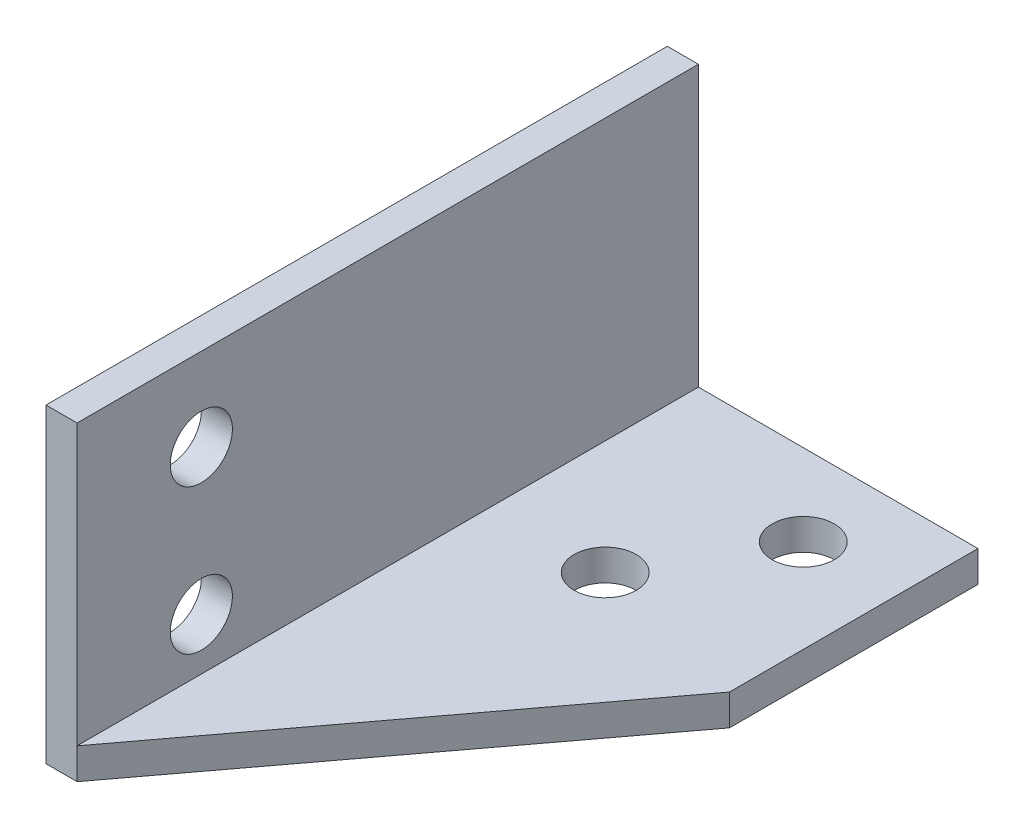
ISO-10303-21;
HEADER;
FILE_DESCRIPTION(('STEP AP214'),'2;1');
FILE_NAME('part.step','',(''),(''),'','','');
FILE_SCHEMA(('AUTOMOTIVE_DESIGN { 1 0 10303 214 1 1 1 1 }'));
ENDSEC;
DATA;
#1=APPLICATION_CONTEXT('core data for automotive mechanical design processes');
#2=APPLICATION_PROTOCOL_DEFINITION('international standard','automotive_design',2000,#1);
#3=PRODUCT_CONTEXT('',#1,'mechanical');
#4=PRODUCT('Part','Part','',(#3));
#5=PRODUCT_RELATED_PRODUCT_CATEGORY('part','',(#4));
#6=PRODUCT_DEFINITION_FORMATION('','',#4);
#7=PRODUCT_DEFINITION_CONTEXT('part definition',#1,'design');
#8=PRODUCT_DEFINITION('design','',#6,#7);
#9=PRODUCT_DEFINITION_SHAPE('','',#8);
#10=(LENGTH_UNIT() NAMED_UNIT(*) SI_UNIT(.MILLI.,.METRE.));
#11=(NAMED_UNIT(*) PLANE_ANGLE_UNIT() SI_UNIT($,.RADIAN.));
#12=(NAMED_UNIT(*) SI_UNIT($,.STERADIAN.) SOLID_ANGLE_UNIT());
#13=UNCERTAINTY_MEASURE_WITH_UNIT(LENGTH_MEASURE(1.E-05),#10,'distance_accuracy_value','');
#14=(GEOMETRIC_REPRESENTATION_CONTEXT(3) GLOBAL_UNCERTAINTY_ASSIGNED_CONTEXT((#13)) GLOBAL_UNIT_ASSIGNED_CONTEXT((#10,
#11,#12)) REPRESENTATION_CONTEXT('',''));
#15=CARTESIAN_POINT('',(0.,0.,0.));
#16=DIRECTION('',(0.,0.,1.));
#17=DIRECTION('',(1.,0.,0.));
#18=AXIS2_PLACEMENT_3D('',#15,#16,#17);
#19=CARTESIAN_POINT('',(-9.77300216930946,-21.59,30.));
#20=DIRECTION('',(1.,0.,0.));
#21=DIRECTION('',(0.,0.,-1.));
#22=AXIS2_PLACEMENT_3D('',#19,#20,#21);
#23=PLANE('',#22);
#24=CARTESIAN_POINT('',(-9.77300216930946,-17.59,24.));
#25=DIRECTION('',(1.,0.,0.));
#26=DIRECTION('',(0.,0.,-1.));
#27=AXIS2_PLACEMENT_3D('',#24,#25,#26);
#28=CIRCLE('',#27,1.5);
#29=CARTESIAN_POINT('',(-9.77300216930946,-17.59,22.5));
#30=VERTEX_POINT('',#29);
#31=EDGE_CURVE('E158',#30,#30,#28,.T.);
#32=ORIENTED_EDGE('',*,*,#31,.T.);
#33=EDGE_LOOP('',(#32));
#34=FACE_BOUND('',#33,.T.);
#35=CARTESIAN_POINT('',(-9.77300216930946,-10.59,24.));
#36=DIRECTION('',(1.,0.,0.));
#37=DIRECTION('',(0.,0.,-1.));
#38=AXIS2_PLACEMENT_3D('',#35,#36,#37);
#39=CIRCLE('',#38,1.5);
#40=CARTESIAN_POINT('',(-9.77300216930946,-10.59,22.5));
#41=VERTEX_POINT('',#40);
#42=EDGE_CURVE('E134',#41,#41,#39,.T.);
#43=ORIENTED_EDGE('',*,*,#42,.T.);
#44=EDGE_LOOP('',(#43));
#45=FACE_BOUND('',#44,.T.);
#46=DIRECTION('',(0.,-1.,0.));
#47=VECTOR('',#46,1.);
#48=CARTESIAN_POINT('',(-9.77300216930946,-21.59,0.));
#49=LINE('',#48,#47);
#50=CARTESIAN_POINT('',(-9.77300216930946,-6.59,0.));
#51=VERTEX_POINT('',#50);
#52=CARTESIAN_POINT('',(-9.77300216930946,-21.59,0.));
#53=VERTEX_POINT('',#52);
#54=EDGE_CURVE('E131',#51,#53,#49,.T.);
#55=ORIENTED_EDGE('',*,*,#54,.T.);
#56=DIRECTION('',(0.,0.,-1.));
#57=VECTOR('',#56,1.);
#58=CARTESIAN_POINT('',(-9.77300216930946,-21.59,30.));
#59=LINE('',#58,#57);
#60=CARTESIAN_POINT('',(-9.77300216930946,-21.59,30.));
#61=VERTEX_POINT('',#60);
#62=EDGE_CURVE('E38',#61,#53,#59,.T.);
#63=ORIENTED_EDGE('',*,*,#62,.F.);
#64=DIRECTION('',(0.,-1.,0.));
#65=VECTOR('',#64,1.);
#66=CARTESIAN_POINT('',(-9.77300216930946,-21.59,30.));
#67=LINE('',#66,#65);
#68=CARTESIAN_POINT('',(-9.77300216930946,-6.59,30.));
#69=VERTEX_POINT('',#68);
#70=EDGE_CURVE('E148',#69,#61,#67,.T.);
#71=ORIENTED_EDGE('',*,*,#70,.F.);
#72=DIRECTION('',(0.,0.,-1.));
#73=VECTOR('',#72,1.);
#74=CARTESIAN_POINT('',(-9.77300216930946,-6.59,30.));
#75=LINE('',#74,#73);
#76=EDGE_CURVE('E132',#69,#51,#75,.T.);
#77=ORIENTED_EDGE('',*,*,#76,.T.);
#78=EDGE_LOOP('',(#55,#63,#71,#77));
#79=FACE_BOUND('',#78,.T.);
#80=ADVANCED_FACE('F30',(#34,#45,#79),#23,.F.);
#81=CARTESIAN_POINT('',(5.22699783069054,-21.59,30.));
#82=DIRECTION('',(0.,1.,0.));
#83=DIRECTION('',(0.,0.,1.));
#84=AXIS2_PLACEMENT_3D('',#81,#82,#83);
#85=PLANE('',#84);
#86=CARTESIAN_POINT('',(0.726997830690543,-21.59,3.93782217350893));
#87=DIRECTION('',(0.,1.,0.));
#88=DIRECTION('',(0.,0.,1.));
#89=AXIS2_PLACEMENT_3D('',#86,#87,#88);
#90=CIRCLE('',#89,1.5);
#91=CARTESIAN_POINT('',(0.726997830690543,-21.59,5.43782217350893));
#92=VERTEX_POINT('',#91);
#93=EDGE_CURVE('E170',#92,#92,#90,.T.);
#94=ORIENTED_EDGE('',*,*,#93,.T.);
#95=EDGE_LOOP('',(#94));
#96=FACE_BOUND('',#95,.T.);
#97=CARTESIAN_POINT('',(-2.77300216930946,-21.59,10.));
#98=DIRECTION('',(0.,1.,0.));
#99=DIRECTION('',(0.,0.,1.));
#100=AXIS2_PLACEMENT_3D('',#97,#98,#99);
#101=CIRCLE('',#100,1.5);
#102=CARTESIAN_POINT('',(-2.77300216930946,-21.59,11.5));
#103=VERTEX_POINT('',#102);
#104=EDGE_CURVE('E164',#103,#103,#101,.T.);
#105=ORIENTED_EDGE('',*,*,#104,.T.);
#106=EDGE_LOOP('',(#105));
#107=FACE_BOUND('',#106,.T.);
#108=DIRECTION('',(0.,0.,-1.));
#109=VECTOR('',#108,1.);
#110=CARTESIAN_POINT('',(5.22699783069054,-21.59,30.));
#111=LINE('',#110,#109);
#112=CARTESIAN_POINT('',(5.22699783069054,-21.59,12.));
#113=VERTEX_POINT('',#112);
#114=CARTESIAN_POINT('',(5.22699783069054,-21.59,0.));
#115=VERTEX_POINT('',#114);
#116=EDGE_CURVE('E117',#113,#115,#111,.T.);
#117=ORIENTED_EDGE('',*,*,#116,.F.);
#118=DIRECTION('',(-0.6,0.,0.8));
#119=VECTOR('',#118,1.);
#120=CARTESIAN_POINT('',(-3.41300216930946,-21.59,23.52));
#121=LINE('',#120,#119);
#122=CARTESIAN_POINT('',(-8.27300216930946,-21.59,30.));
#123=VERTEX_POINT('',#122);
#124=EDGE_CURVE('E100',#113,#123,#121,.T.);
#125=ORIENTED_EDGE('',*,*,#124,.T.);
#126=DIRECTION('',(1.,0.,0.));
#127=VECTOR('',#126,1.);
#128=CARTESIAN_POINT('',(5.22699783069054,-21.59,30.));
#129=LINE('',#128,#127);
#130=EDGE_CURVE('E84',#61,#123,#129,.T.);
#131=ORIENTED_EDGE('',*,*,#130,.F.);
#132=ORIENTED_EDGE('',*,*,#62,.T.);
#133=DIRECTION('',(1.,0.,0.));
#134=VECTOR('',#133,1.);
#135=CARTESIAN_POINT('',(5.22699783069054,-21.59,0.));
#136=LINE('',#135,#134);
#137=EDGE_CURVE('E127',#53,#115,#136,.T.);
#138=ORIENTED_EDGE('',*,*,#137,.T.);
#139=EDGE_LOOP('',(#117,#125,#131,#132,#138));
#140=FACE_BOUND('',#139,.T.);
#141=ADVANCED_FACE('F126',(#96,#107,#140),#85,.F.);
#142=CARTESIAN_POINT('',(5.22699783069054,-20.09,30.));
#143=DIRECTION('',(-1.,0.,0.));
#144=DIRECTION('',(0.,0.,1.));
#145=AXIS2_PLACEMENT_3D('',#142,#143,#144);
#146=PLANE('',#145);
#147=DIRECTION('',(0.,0.,-1.));
#148=VECTOR('',#147,1.);
#149=CARTESIAN_POINT('',(5.22699783069054,-20.09,30.));
#150=LINE('',#149,#148);
#151=CARTESIAN_POINT('',(5.22699783069054,-20.09,12.));
#152=VERTEX_POINT('',#151);
#153=CARTESIAN_POINT('',(5.22699783069054,-20.09,0.));
#154=VERTEX_POINT('',#153);
#155=EDGE_CURVE('E108',#152,#154,#150,.T.);
#156=ORIENTED_EDGE('',*,*,#155,.F.);
#157=DIRECTION('',(0.,1.,0.));
#158=VECTOR('',#157,1.);
#159=CARTESIAN_POINT('',(5.22699783069054,-80.09,12.));
#160=LINE('',#159,#158);
#161=EDGE_CURVE('E96',#113,#152,#160,.T.);
#162=ORIENTED_EDGE('',*,*,#161,.F.);
#163=ORIENTED_EDGE('',*,*,#116,.T.);
#164=DIRECTION('',(0.,1.,0.));
#165=VECTOR('',#164,1.);
#166=CARTESIAN_POINT('',(5.22699783069054,-20.09,0.));
#167=LINE('',#166,#165);
#168=EDGE_CURVE('E115',#115,#154,#167,.T.);
#169=ORIENTED_EDGE('',*,*,#168,.T.);
#170=EDGE_LOOP('',(#156,#162,#163,#169));
#171=FACE_BOUND('',#170,.T.);
#172=ADVANCED_FACE('F113',(#171),#146,.F.);
#173=CARTESIAN_POINT('',(-8.27300216930946,-20.09,30.));
#174=DIRECTION('',(0.,-1.,0.));
#175=DIRECTION('',(0.,0.,-1.));
#176=AXIS2_PLACEMENT_3D('',#173,#174,#175);
#177=PLANE('',#176);
#178=CARTESIAN_POINT('',(0.726997830690543,-20.09,3.93782217350893));
#179=DIRECTION('',(0.,1.,0.));
#180=DIRECTION('',(0.,0.,1.));
#181=AXIS2_PLACEMENT_3D('',#178,#179,#180);
#182=CIRCLE('',#181,1.5);
#183=CARTESIAN_POINT('',(0.726997830690543,-20.09,5.43782217350893));
#184=VERTEX_POINT('',#183);
#185=EDGE_CURVE('E173',#184,#184,#182,.T.);
#186=ORIENTED_EDGE('',*,*,#185,.F.);
#187=EDGE_LOOP('',(#186));
#188=FACE_BOUND('',#187,.T.);
#189=CARTESIAN_POINT('',(-2.77300216930946,-20.09,10.));
#190=DIRECTION('',(0.,1.,0.));
#191=DIRECTION('',(0.,0.,1.));
#192=AXIS2_PLACEMENT_3D('',#189,#190,#191);
#193=CIRCLE('',#192,1.5);
#194=CARTESIAN_POINT('',(-2.77300216930946,-20.09,11.5));
#195=VERTEX_POINT('',#194);
#196=EDGE_CURVE('E167',#195,#195,#193,.T.);
#197=ORIENTED_EDGE('',*,*,#196,.F.);
#198=EDGE_LOOP('',(#197));
#199=FACE_BOUND('',#198,.T.);
#200=DIRECTION('',(0.,0.,-1.));
#201=VECTOR('',#200,1.);
#202=CARTESIAN_POINT('',(-8.27300216930946,-20.09,30.));
#203=LINE('',#202,#201);
#204=CARTESIAN_POINT('',(-8.27300216930946,-20.09,30.));
#205=VERTEX_POINT('',#204);
#206=CARTESIAN_POINT('',(-8.27300216930946,-20.09,0.));
#207=VERTEX_POINT('',#206);
#208=EDGE_CURVE('E110',#205,#207,#203,.T.);
#209=ORIENTED_EDGE('',*,*,#208,.F.);
#210=DIRECTION('',(-0.6,0.,0.8));
#211=VECTOR('',#210,1.);
#212=CARTESIAN_POINT('',(-8.27300216930946,-20.09,30.));
#213=LINE('',#212,#211);
#214=EDGE_CURVE('E99',#152,#205,#213,.T.);
#215=ORIENTED_EDGE('',*,*,#214,.F.);
#216=ORIENTED_EDGE('',*,*,#155,.T.);
#217=DIRECTION('',(-1.,0.,0.));
#218=VECTOR('',#217,1.);
#219=CARTESIAN_POINT('',(-8.27300216930946,-20.09,0.));
#220=LINE('',#219,#218);
#221=EDGE_CURVE('E144',#154,#207,#220,.T.);
#222=ORIENTED_EDGE('',*,*,#221,.T.);
#223=EDGE_LOOP('',(#209,#215,#216,#222));
#224=FACE_BOUND('',#223,.T.);
#225=ADVANCED_FACE('F107',(#188,#199,#224),#177,.F.);
#226=CARTESIAN_POINT('',(-8.27300216930946,-6.59,30.));
#227=DIRECTION('',(-1.,0.,0.));
#228=DIRECTION('',(0.,-1.,0.));
#229=AXIS2_PLACEMENT_3D('',#226,#227,#228);
#230=PLANE('',#229);
#231=CARTESIAN_POINT('',(-8.27300216930945,-17.59,24.));
#232=DIRECTION('',(1.,0.,0.));
#233=DIRECTION('',(0.,1.,0.));
#234=AXIS2_PLACEMENT_3D('',#231,#232,#233);
#235=CIRCLE('',#234,1.5);
#236=CARTESIAN_POINT('',(-8.27300216930945,-16.09,24.));
#237=VERTEX_POINT('',#236);
#238=EDGE_CURVE('E161',#237,#237,#235,.T.);
#239=ORIENTED_EDGE('',*,*,#238,.F.);
#240=EDGE_LOOP('',(#239));
#241=FACE_BOUND('',#240,.T.);
#242=CARTESIAN_POINT('',(-8.27300216930945,-10.59,24.));
#243=DIRECTION('',(1.,0.,0.));
#244=DIRECTION('',(0.,1.,0.));
#245=AXIS2_PLACEMENT_3D('',#242,#243,#244);
#246=CIRCLE('',#245,1.5);
#247=CARTESIAN_POINT('',(-8.27300216930945,-9.09,24.));
#248=VERTEX_POINT('',#247);
#249=EDGE_CURVE('E138',#248,#248,#246,.T.);
#250=ORIENTED_EDGE('',*,*,#249,.F.);
#251=EDGE_LOOP('',(#250));
#252=FACE_BOUND('',#251,.T.);
#253=DIRECTION('',(0.,1.,0.));
#254=VECTOR('',#253,1.);
#255=CARTESIAN_POINT('',(-8.27300216930946,-6.59,0.));
#256=LINE('',#255,#254);
#257=CARTESIAN_POINT('',(-8.27300216930946,-6.59,0.));
#258=VERTEX_POINT('',#257);
#259=EDGE_CURVE('E70',#207,#258,#256,.T.);
#260=ORIENTED_EDGE('',*,*,#259,.T.);
#261=DIRECTION('',(0.,0.,-1.));
#262=VECTOR('',#261,1.);
#263=CARTESIAN_POINT('',(-8.27300216930946,-6.59,30.));
#264=LINE('',#263,#262);
#265=CARTESIAN_POINT('',(-8.27300216930946,-6.59,30.));
#266=VERTEX_POINT('',#265);
#267=EDGE_CURVE('E120',#266,#258,#264,.T.);
#268=ORIENTED_EDGE('',*,*,#267,.F.);
#269=DIRECTION('',(0.,1.,0.));
#270=VECTOR('',#269,1.);
#271=CARTESIAN_POINT('',(-8.27300216930946,-6.59,30.));
#272=LINE('',#271,#270);
#273=EDGE_CURVE('E152',#205,#266,#272,.T.);
#274=ORIENTED_EDGE('',*,*,#273,.F.);
#275=ORIENTED_EDGE('',*,*,#208,.T.);
#276=EDGE_LOOP('',(#260,#268,#274,#275));
#277=FACE_BOUND('',#276,.T.);
#278=ADVANCED_FACE('F151',(#241,#252,#277),#230,.F.);
#279=CARTESIAN_POINT('',(-9.77300216930946,-6.59,30.));
#280=DIRECTION('',(0.,-1.,0.));
#281=DIRECTION('',(0.,0.,-1.));
#282=AXIS2_PLACEMENT_3D('',#279,#280,#281);
#283=PLANE('',#282);
#284=DIRECTION('',(-1.,0.,0.));
#285=VECTOR('',#284,1.);
#286=CARTESIAN_POINT('',(-9.77300216930946,-6.59,0.));
#287=LINE('',#286,#285);
#288=EDGE_CURVE('E76',#258,#51,#287,.T.);
#289=ORIENTED_EDGE('',*,*,#288,.T.);
#290=ORIENTED_EDGE('',*,*,#76,.F.);
#291=DIRECTION('',(-1.,0.,0.));
#292=VECTOR('',#291,1.);
#293=CARTESIAN_POINT('',(-9.77300216930946,-6.59,30.));
#294=LINE('',#293,#292);
#295=EDGE_CURVE('E46',#266,#69,#294,.T.);
#296=ORIENTED_EDGE('',*,*,#295,.F.);
#297=ORIENTED_EDGE('',*,*,#267,.T.);
#298=EDGE_LOOP('',(#289,#290,#296,#297));
#299=FACE_BOUND('',#298,.T.);
#300=ADVANCED_FACE('F149',(#299),#283,.F.);
#301=CARTESIAN_POINT('',(-9.77300216930946,-6.59,30.));
#302=DIRECTION('',(0.,0.,-1.));
#303=DIRECTION('',(-1.,0.,0.));
#304=AXIS2_PLACEMENT_3D('',#301,#302,#303);
#305=PLANE('',#304);
#306=ORIENTED_EDGE('',*,*,#130,.T.);
#307=DIRECTION('',(0.,1.,0.));
#308=VECTOR('',#307,1.);
#309=CARTESIAN_POINT('',(-8.27300216930946,-6.59,30.));
#310=LINE('',#309,#308);
#311=EDGE_CURVE('E11',#123,#205,#310,.T.);
#312=ORIENTED_EDGE('',*,*,#311,.T.);
#313=ORIENTED_EDGE('',*,*,#273,.T.);
#314=ORIENTED_EDGE('',*,*,#295,.T.);
#315=ORIENTED_EDGE('',*,*,#70,.T.);
#316=EDGE_LOOP('',(#306,#312,#313,#314,#315));
#317=FACE_BOUND('',#316,.T.);
#318=ADVANCED_FACE('F176',(#317),#305,.F.);
#319=CARTESIAN_POINT('',(-9.77300216930946,-6.59,0.));
#320=DIRECTION('',(0.,0.,-1.));
#321=DIRECTION('',(-1.,0.,0.));
#322=AXIS2_PLACEMENT_3D('',#319,#320,#321);
#323=PLANE('',#322);
#324=ORIENTED_EDGE('',*,*,#54,.F.);
#325=ORIENTED_EDGE('',*,*,#288,.F.);
#326=ORIENTED_EDGE('',*,*,#259,.F.);
#327=ORIENTED_EDGE('',*,*,#221,.F.);
#328=ORIENTED_EDGE('',*,*,#168,.F.);
#329=ORIENTED_EDGE('',*,*,#137,.F.);
#330=EDGE_LOOP('',(#324,#325,#326,#327,#328,#329));
#331=FACE_BOUND('',#330,.T.);
#332=ADVANCED_FACE('F150',(#331),#323,.T.);
#333=CARTESIAN_POINT('',(-68.2730021693094,-10.59,24.));
#334=DIRECTION('',(1.,0.,0.));
#335=DIRECTION('',(0.,1.,0.));
#336=AXIS2_PLACEMENT_3D('',#333,#334,#335);
#337=CYLINDRICAL_SURFACE('',#336,1.5);
#338=ORIENTED_EDGE('',*,*,#249,.T.);
#339=EDGE_LOOP('',(#338));
#340=FACE_BOUND('',#339,.T.);
#341=ORIENTED_EDGE('',*,*,#42,.F.);
#342=EDGE_LOOP('',(#341));
#343=FACE_BOUND('',#342,.T.);
#344=ADVANCED_FACE('F183',(#340,#343),#337,.F.);
#345=CARTESIAN_POINT('',(-68.2730021693094,-17.59,24.));
#346=DIRECTION('',(1.,0.,0.));
#347=DIRECTION('',(0.,1.,0.));
#348=AXIS2_PLACEMENT_3D('',#345,#346,#347);
#349=CYLINDRICAL_SURFACE('',#348,1.5);
#350=ORIENTED_EDGE('',*,*,#238,.T.);
#351=EDGE_LOOP('',(#350));
#352=FACE_BOUND('',#351,.T.);
#353=ORIENTED_EDGE('',*,*,#31,.F.);
#354=EDGE_LOOP('',(#353));
#355=FACE_BOUND('',#354,.T.);
#356=ADVANCED_FACE('F198',(#352,#355),#349,.F.);
#357=CARTESIAN_POINT('',(-2.77300216930946,-80.09,10.));
#358=DIRECTION('',(0.,1.,0.));
#359=DIRECTION('',(0.,0.,1.));
#360=AXIS2_PLACEMENT_3D('',#357,#358,#359);
#361=CYLINDRICAL_SURFACE('',#360,1.5);
#362=ORIENTED_EDGE('',*,*,#196,.T.);
#363=EDGE_LOOP('',(#362));
#364=FACE_BOUND('',#363,.T.);
#365=ORIENTED_EDGE('',*,*,#104,.F.);
#366=EDGE_LOOP('',(#365));
#367=FACE_BOUND('',#366,.T.);
#368=ADVANCED_FACE('F203',(#364,#367),#361,.F.);
#369=CARTESIAN_POINT('',(0.726997830690543,-80.09,3.93782217350893));
#370=DIRECTION('',(0.,1.,0.));
#371=DIRECTION('',(0.,0.,1.));
#372=AXIS2_PLACEMENT_3D('',#369,#370,#371);
#373=CYLINDRICAL_SURFACE('',#372,1.5);
#374=ORIENTED_EDGE('',*,*,#185,.T.);
#375=EDGE_LOOP('',(#374));
#376=FACE_BOUND('',#375,.T.);
#377=ORIENTED_EDGE('',*,*,#93,.F.);
#378=EDGE_LOOP('',(#377));
#379=FACE_BOUND('',#378,.T.);
#380=ADVANCED_FACE('F209',(#376,#379),#373,.F.);
#381=CARTESIAN_POINT('',(-8.27300216930946,-80.09,30.));
#382=DIRECTION('',(-0.8,0.,-0.6));
#383=DIRECTION('',(-0.6,0.,0.8));
#384=AXIS2_PLACEMENT_3D('',#381,#382,#383);
#385=PLANE('',#384);
#386=ORIENTED_EDGE('',*,*,#161,.T.);
#387=ORIENTED_EDGE('',*,*,#214,.T.);
#388=ORIENTED_EDGE('',*,*,#311,.F.);
#389=ORIENTED_EDGE('',*,*,#124,.F.);
#390=EDGE_LOOP('',(#386,#387,#388,#389));
#391=FACE_BOUND('',#390,.T.);
#392=ADVANCED_FACE('F98',(#391),#385,.F.);
#393=CLOSED_SHELL('',(#80,#141,#172,#225,#278,#300,#318,#332,#344,#356,#368,#380,#392));
#394=MANIFOLD_SOLID_BREP('B2',#393);
#395=ADVANCED_BREP_SHAPE_REPRESENTATION('',(#18,#394),#14);
#396=SHAPE_DEFINITION_REPRESENTATION(#9,#395);
ENDSEC;
END-ISO-10303-21;
